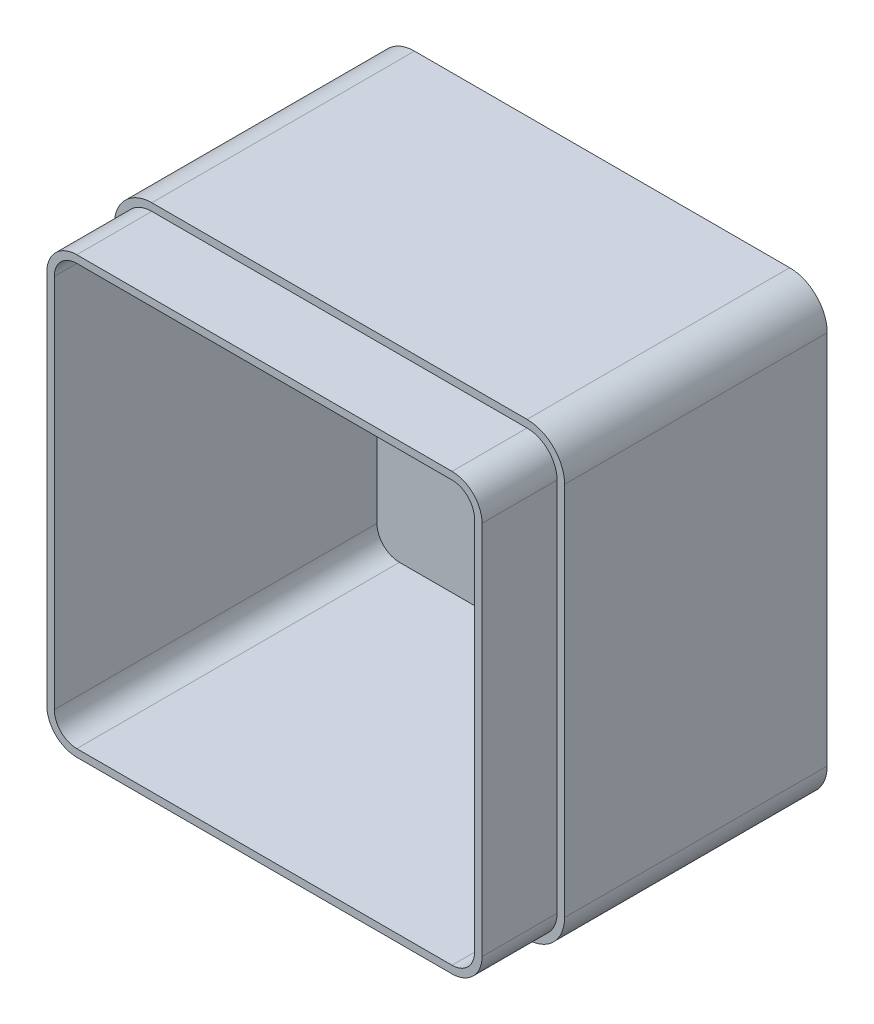
ISO-10303-21;
HEADER;
FILE_DESCRIPTION(('STEP AP214'),'2;1');
FILE_NAME('part.step','',(''),(''),'','','');
FILE_SCHEMA(('AUTOMOTIVE_DESIGN { 1 0 10303 214 1 1 1 1 }'));
ENDSEC;
DATA;
#1=APPLICATION_CONTEXT('core data for automotive mechanical design processes');
#2=APPLICATION_PROTOCOL_DEFINITION('international standard','automotive_design',2000,#1);
#3=PRODUCT_CONTEXT('',#1,'mechanical');
#4=PRODUCT('Part','Part','',(#3));
#5=PRODUCT_RELATED_PRODUCT_CATEGORY('part','',(#4));
#6=PRODUCT_DEFINITION_FORMATION('','',#4);
#7=PRODUCT_DEFINITION_CONTEXT('part definition',#1,'design');
#8=PRODUCT_DEFINITION('design','',#6,#7);
#9=PRODUCT_DEFINITION_SHAPE('','',#8);
#10=(LENGTH_UNIT() NAMED_UNIT(*) SI_UNIT(.MILLI.,.METRE.));
#11=(NAMED_UNIT(*) PLANE_ANGLE_UNIT() SI_UNIT($,.RADIAN.));
#12=(NAMED_UNIT(*) SI_UNIT($,.STERADIAN.) SOLID_ANGLE_UNIT());
#13=UNCERTAINTY_MEASURE_WITH_UNIT(LENGTH_MEASURE(1.E-05),#10,'distance_accuracy_value','');
#14=(GEOMETRIC_REPRESENTATION_CONTEXT(3) GLOBAL_UNCERTAINTY_ASSIGNED_CONTEXT((#13)) GLOBAL_UNIT_ASSIGNED_CONTEXT((#10,
#11,#12)) REPRESENTATION_CONTEXT('',''));
#15=CARTESIAN_POINT('',(0.,0.,0.));
#16=DIRECTION('',(0.,0.,1.));
#17=DIRECTION('',(1.,0.,0.));
#18=AXIS2_PLACEMENT_3D('',#15,#16,#17);
#19=CARTESIAN_POINT('',(0.,0.,90.));
#20=DIRECTION('',(0.,0.,-1.));
#21=DIRECTION('',(-1.,0.,0.));
#22=AXIS2_PLACEMENT_3D('',#19,#20,#21);
#23=PLANE('',#22);
#24=DIRECTION('',(1.,0.,0.));
#25=VECTOR('',#24,1.);
#26=CARTESIAN_POINT('',(0.,4.,90.));
#27=LINE('',#26,#25);
#28=CARTESIAN_POINT('',(9.99999999999999,4.,90.));
#29=VERTEX_POINT('',#28);
#30=CARTESIAN_POINT('',(110.,4.,90.));
#31=VERTEX_POINT('',#30);
#32=EDGE_CURVE('E329',#29,#31,#27,.T.);
#33=ORIENTED_EDGE('',*,*,#32,.F.);
#34=CARTESIAN_POINT('',(10.,10.,90.));
#35=DIRECTION('',(0.,0.,-1.));
#36=DIRECTION('',(-1.,0.,0.));
#37=AXIS2_PLACEMENT_3D('',#34,#35,#36);
#38=CIRCLE('',#37,6.);
#39=CARTESIAN_POINT('',(4.,9.99999999999999,90.));
#40=VERTEX_POINT('',#39);
#41=EDGE_CURVE('E330',#40,#29,#38,.F.);
#42=ORIENTED_EDGE('',*,*,#41,.F.);
#43=DIRECTION('',(0.,-1.,0.));
#44=VECTOR('',#43,1.);
#45=CARTESIAN_POINT('',(4.,0.,90.));
#46=LINE('',#45,#44);
#47=CARTESIAN_POINT('',(4.,110.,90.));
#48=VERTEX_POINT('',#47);
#49=EDGE_CURVE('E310',#48,#40,#46,.T.);
#50=ORIENTED_EDGE('',*,*,#49,.F.);
#51=CARTESIAN_POINT('',(10.,110.,90.));
#52=DIRECTION('',(0.,0.,-1.));
#53=DIRECTION('',(-1.,0.,0.));
#54=AXIS2_PLACEMENT_3D('',#51,#52,#53);
#55=CIRCLE('',#54,6.);
#56=CARTESIAN_POINT('',(9.99999999999999,116.,90.));
#57=VERTEX_POINT('',#56);
#58=EDGE_CURVE('E332',#57,#48,#55,.F.);
#59=ORIENTED_EDGE('',*,*,#58,.F.);
#60=DIRECTION('',(-1.,0.,0.));
#61=VECTOR('',#60,1.);
#62=CARTESIAN_POINT('',(0.,116.,90.));
#63=LINE('',#62,#61);
#64=CARTESIAN_POINT('',(110.,116.,90.));
#65=VERTEX_POINT('',#64);
#66=EDGE_CURVE('E322',#65,#57,#63,.T.);
#67=ORIENTED_EDGE('',*,*,#66,.F.);
#68=CARTESIAN_POINT('',(110.,110.,90.));
#69=DIRECTION('',(0.,0.,-1.));
#70=DIRECTION('',(-1.,0.,0.));
#71=AXIS2_PLACEMENT_3D('',#68,#69,#70);
#72=CIRCLE('',#71,6.);
#73=CARTESIAN_POINT('',(116.,110.,90.));
#74=VERTEX_POINT('',#73);
#75=EDGE_CURVE('E315',#74,#65,#72,.F.);
#76=ORIENTED_EDGE('',*,*,#75,.F.);
#77=DIRECTION('',(0.,1.,0.));
#78=VECTOR('',#77,1.);
#79=CARTESIAN_POINT('',(116.,0.,90.));
#80=LINE('',#79,#78);
#81=CARTESIAN_POINT('',(116.,9.99999999999999,90.));
#82=VERTEX_POINT('',#81);
#83=EDGE_CURVE('E335',#82,#74,#80,.T.);
#84=ORIENTED_EDGE('',*,*,#83,.F.);
#85=CARTESIAN_POINT('',(110.,10.,90.));
#86=DIRECTION('',(0.,0.,-1.));
#87=DIRECTION('',(-1.,0.,0.));
#88=AXIS2_PLACEMENT_3D('',#85,#86,#87);
#89=CIRCLE('',#88,6.);
#90=EDGE_CURVE('E293',#31,#82,#89,.F.);
#91=ORIENTED_EDGE('',*,*,#90,.F.);
#92=EDGE_LOOP('',(#33,#42,#50,#59,#67,#76,#84,#91));
#93=FACE_BOUND('',#92,.T.);
#94=CARTESIAN_POINT('',(10.,110.,90.));
#95=DIRECTION('',(0.,0.,1.));
#96=DIRECTION('',(1.,0.,0.));
#97=AXIS2_PLACEMENT_3D('',#94,#95,#96);
#98=CIRCLE('',#97,8.);
#99=CARTESIAN_POINT('',(9.99999999999999,118.,90.));
#100=VERTEX_POINT('',#99);
#101=CARTESIAN_POINT('',(2.,110.,90.));
#102=VERTEX_POINT('',#101);
#103=EDGE_CURVE('E240',#100,#102,#98,.T.);
#104=ORIENTED_EDGE('',*,*,#103,.T.);
#105=DIRECTION('',(0.,-1.,0.));
#106=VECTOR('',#105,1.);
#107=CARTESIAN_POINT('',(2.,110.,90.));
#108=LINE('',#107,#106);
#109=CARTESIAN_POINT('',(2.,9.99999999999999,90.));
#110=VERTEX_POINT('',#109);
#111=EDGE_CURVE('E200',#102,#110,#108,.T.);
#112=ORIENTED_EDGE('',*,*,#111,.T.);
#113=CARTESIAN_POINT('',(10.,10.,90.));
#114=DIRECTION('',(0.,0.,1.));
#115=DIRECTION('',(1.,0.,0.));
#116=AXIS2_PLACEMENT_3D('',#113,#114,#115);
#117=CIRCLE('',#116,8.);
#118=CARTESIAN_POINT('',(9.99999999999999,2.,90.));
#119=VERTEX_POINT('',#118);
#120=EDGE_CURVE('E48',#110,#119,#117,.T.);
#121=ORIENTED_EDGE('',*,*,#120,.T.);
#122=DIRECTION('',(1.,0.,0.));
#123=VECTOR('',#122,1.);
#124=CARTESIAN_POINT('',(9.99999999999999,2.,90.));
#125=LINE('',#124,#123);
#126=CARTESIAN_POINT('',(110.,2.,90.));
#127=VERTEX_POINT('',#126);
#128=EDGE_CURVE('E244',#119,#127,#125,.T.);
#129=ORIENTED_EDGE('',*,*,#128,.T.);
#130=CARTESIAN_POINT('',(110.,10.,90.));
#131=DIRECTION('',(0.,0.,1.));
#132=DIRECTION('',(1.,0.,0.));
#133=AXIS2_PLACEMENT_3D('',#130,#131,#132);
#134=CIRCLE('',#133,7.99999999999999);
#135=CARTESIAN_POINT('',(118.,10.,90.));
#136=VERTEX_POINT('',#135);
#137=EDGE_CURVE('E247',#127,#136,#134,.T.);
#138=ORIENTED_EDGE('',*,*,#137,.T.);
#139=DIRECTION('',(0.,1.,0.));
#140=VECTOR('',#139,1.);
#141=CARTESIAN_POINT('',(118.,9.99999999999999,90.));
#142=LINE('',#141,#140);
#143=CARTESIAN_POINT('',(118.,110.,90.));
#144=VERTEX_POINT('',#143);
#145=EDGE_CURVE('E250',#136,#144,#142,.T.);
#146=ORIENTED_EDGE('',*,*,#145,.T.);
#147=CARTESIAN_POINT('',(110.,110.,90.));
#148=DIRECTION('',(0.,0.,1.));
#149=DIRECTION('',(1.,0.,0.));
#150=AXIS2_PLACEMENT_3D('',#147,#148,#149);
#151=CIRCLE('',#150,7.99999999999999);
#152=CARTESIAN_POINT('',(110.,118.,90.));
#153=VERTEX_POINT('',#152);
#154=EDGE_CURVE('E223',#144,#153,#151,.T.);
#155=ORIENTED_EDGE('',*,*,#154,.T.);
#156=DIRECTION('',(-1.,0.,0.));
#157=VECTOR('',#156,1.);
#158=CARTESIAN_POINT('',(110.,118.,90.));
#159=LINE('',#158,#157);
#160=EDGE_CURVE('E220',#153,#100,#159,.T.);
#161=ORIENTED_EDGE('',*,*,#160,.T.);
#162=EDGE_LOOP('',(#104,#112,#121,#129,#138,#146,#155,#161));
#163=FACE_BOUND('',#162,.T.);
#164=ADVANCED_FACE('F33',(#93,#163),#23,.F.);
#165=CARTESIAN_POINT('',(4.,0.,90.));
#166=DIRECTION('',(1.,0.,0.));
#167=DIRECTION('',(0.,0.,-1.));
#168=AXIS2_PLACEMENT_3D('',#165,#166,#167);
#169=PLANE('',#168);
#170=DIRECTION('',(0.,-1.,0.));
#171=VECTOR('',#170,1.);
#172=CARTESIAN_POINT('',(4.,0.,4.));
#173=LINE('',#172,#171);
#174=CARTESIAN_POINT('',(4.,110.,4.));
#175=VERTEX_POINT('',#174);
#176=CARTESIAN_POINT('',(4.,9.99999999999999,4.));
#177=VERTEX_POINT('',#176);
#178=EDGE_CURVE('E282',#175,#177,#173,.T.);
#179=ORIENTED_EDGE('',*,*,#178,.F.);
#180=DIRECTION('',(0.,0.,-1.));
#181=VECTOR('',#180,1.);
#182=CARTESIAN_POINT('',(4.,110.,90.));
#183=LINE('',#182,#181);
#184=EDGE_CURVE('E290',#48,#175,#183,.T.);
#185=ORIENTED_EDGE('',*,*,#184,.F.);
#186=ORIENTED_EDGE('',*,*,#49,.T.);
#187=DIRECTION('',(0.,0.,-1.));
#188=VECTOR('',#187,1.);
#189=CARTESIAN_POINT('',(4.,9.99999999999999,90.));
#190=LINE('',#189,#188);
#191=EDGE_CURVE('E286',#177,#40,#190,.F.);
#192=ORIENTED_EDGE('',*,*,#191,.F.);
#193=EDGE_LOOP('',(#179,#185,#186,#192));
#194=FACE_BOUND('',#193,.T.);
#195=ADVANCED_FACE('F426',(#194),#169,.T.);
#196=CARTESIAN_POINT('',(0.,4.,90.));
#197=DIRECTION('',(0.,1.,0.));
#198=DIRECTION('',(0.,0.,1.));
#199=AXIS2_PLACEMENT_3D('',#196,#197,#198);
#200=PLANE('',#199);
#201=DIRECTION('',(1.,0.,0.));
#202=VECTOR('',#201,1.);
#203=CARTESIAN_POINT('',(0.,4.,4.));
#204=LINE('',#203,#202);
#205=CARTESIAN_POINT('',(9.99999999999999,4.,4.));
#206=VERTEX_POINT('',#205);
#207=CARTESIAN_POINT('',(110.,4.,4.));
#208=VERTEX_POINT('',#207);
#209=EDGE_CURVE('E285',#206,#208,#204,.T.);
#210=ORIENTED_EDGE('',*,*,#209,.F.);
#211=DIRECTION('',(0.,0.,1.));
#212=VECTOR('',#211,1.);
#213=CARTESIAN_POINT('',(9.99999999999999,4.,90.));
#214=LINE('',#213,#212);
#215=EDGE_CURVE('E300',#29,#206,#214,.F.);
#216=ORIENTED_EDGE('',*,*,#215,.F.);
#217=ORIENTED_EDGE('',*,*,#32,.T.);
#218=DIRECTION('',(0.,0.,1.));
#219=VECTOR('',#218,1.);
#220=CARTESIAN_POINT('',(110.,4.,90.));
#221=LINE('',#220,#219);
#222=EDGE_CURVE('E313',#208,#31,#221,.T.);
#223=ORIENTED_EDGE('',*,*,#222,.F.);
#224=EDGE_LOOP('',(#210,#216,#217,#223));
#225=FACE_BOUND('',#224,.T.);
#226=ADVANCED_FACE('F432',(#225),#200,.T.);
#227=CARTESIAN_POINT('',(116.,0.,90.));
#228=DIRECTION('',(-1.,0.,0.));
#229=DIRECTION('',(0.,0.,1.));
#230=AXIS2_PLACEMENT_3D('',#227,#228,#229);
#231=PLANE('',#230);
#232=ORIENTED_EDGE('',*,*,#83,.T.);
#233=DIRECTION('',(0.,0.,1.));
#234=VECTOR('',#233,1.);
#235=CARTESIAN_POINT('',(116.,110.,90.));
#236=LINE('',#235,#234);
#237=CARTESIAN_POINT('',(116.,110.,4.));
#238=VERTEX_POINT('',#237);
#239=EDGE_CURVE('E320',#238,#74,#236,.T.);
#240=ORIENTED_EDGE('',*,*,#239,.F.);
#241=DIRECTION('',(0.,1.,0.));
#242=VECTOR('',#241,1.);
#243=CARTESIAN_POINT('',(116.,0.,4.));
#244=LINE('',#243,#242);
#245=CARTESIAN_POINT('',(116.,9.99999999999999,4.));
#246=VERTEX_POINT('',#245);
#247=EDGE_CURVE('E294',#246,#238,#244,.T.);
#248=ORIENTED_EDGE('',*,*,#247,.F.);
#249=DIRECTION('',(0.,0.,1.));
#250=VECTOR('',#249,1.);
#251=CARTESIAN_POINT('',(116.,9.99999999999999,90.));
#252=LINE('',#251,#250);
#253=EDGE_CURVE('E312',#82,#246,#252,.F.);
#254=ORIENTED_EDGE('',*,*,#253,.F.);
#255=EDGE_LOOP('',(#232,#240,#248,#254));
#256=FACE_BOUND('',#255,.T.);
#257=ADVANCED_FACE('F622',(#256),#231,.T.);
#258=CARTESIAN_POINT('',(0.,116.,90.));
#259=DIRECTION('',(0.,-1.,0.));
#260=DIRECTION('',(0.,0.,-1.));
#261=AXIS2_PLACEMENT_3D('',#258,#259,#260);
#262=PLANE('',#261);
#263=DIRECTION('',(-1.,0.,0.));
#264=VECTOR('',#263,1.);
#265=CARTESIAN_POINT('',(0.,116.,4.));
#266=LINE('',#265,#264);
#267=CARTESIAN_POINT('',(110.,116.,4.));
#268=VERTEX_POINT('',#267);
#269=CARTESIAN_POINT('',(9.99999999999999,116.,4.));
#270=VERTEX_POINT('',#269);
#271=EDGE_CURVE('E297',#268,#270,#266,.T.);
#272=ORIENTED_EDGE('',*,*,#271,.F.);
#273=DIRECTION('',(0.,0.,-1.));
#274=VECTOR('',#273,1.);
#275=CARTESIAN_POINT('',(110.,116.,90.));
#276=LINE('',#275,#274);
#277=EDGE_CURVE('E289',#65,#268,#276,.T.);
#278=ORIENTED_EDGE('',*,*,#277,.F.);
#279=ORIENTED_EDGE('',*,*,#66,.T.);
#280=DIRECTION('',(0.,0.,-1.));
#281=VECTOR('',#280,1.);
#282=CARTESIAN_POINT('',(9.99999999999999,116.,90.));
#283=LINE('',#282,#281);
#284=EDGE_CURVE('E325',#270,#57,#283,.F.);
#285=ORIENTED_EDGE('',*,*,#284,.F.);
#286=EDGE_LOOP('',(#272,#278,#279,#285));
#287=FACE_BOUND('',#286,.T.);
#288=ADVANCED_FACE('F613',(#287),#262,.T.);
#289=CARTESIAN_POINT('',(0.,0.,4.));
#290=DIRECTION('',(0.,0.,-1.));
#291=DIRECTION('',(-1.,0.,0.));
#292=AXIS2_PLACEMENT_3D('',#289,#290,#291);
#293=PLANE('',#292);
#294=ORIENTED_EDGE('',*,*,#247,.T.);
#295=CARTESIAN_POINT('',(110.,110.,4.));
#296=DIRECTION('',(0.,0.,-1.));
#297=DIRECTION('',(-1.,0.,0.));
#298=AXIS2_PLACEMENT_3D('',#295,#296,#297);
#299=CIRCLE('',#298,6.);
#300=EDGE_CURVE('E307',#268,#238,#299,.T.);
#301=ORIENTED_EDGE('',*,*,#300,.F.);
#302=ORIENTED_EDGE('',*,*,#271,.T.);
#303=CARTESIAN_POINT('',(10.,110.,4.));
#304=DIRECTION('',(0.,0.,-1.));
#305=DIRECTION('',(-1.,0.,0.));
#306=AXIS2_PLACEMENT_3D('',#303,#304,#305);
#307=CIRCLE('',#306,6.);
#308=EDGE_CURVE('E305',#175,#270,#307,.T.);
#309=ORIENTED_EDGE('',*,*,#308,.F.);
#310=ORIENTED_EDGE('',*,*,#178,.T.);
#311=CARTESIAN_POINT('',(10.,10.,4.));
#312=DIRECTION('',(0.,0.,-1.));
#313=DIRECTION('',(-1.,0.,0.));
#314=AXIS2_PLACEMENT_3D('',#311,#312,#313);
#315=CIRCLE('',#314,6.);
#316=EDGE_CURVE('E301',#206,#177,#315,.T.);
#317=ORIENTED_EDGE('',*,*,#316,.F.);
#318=ORIENTED_EDGE('',*,*,#209,.T.);
#319=CARTESIAN_POINT('',(110.,10.,4.));
#320=DIRECTION('',(0.,0.,-1.));
#321=DIRECTION('',(-1.,0.,0.));
#322=AXIS2_PLACEMENT_3D('',#319,#320,#321);
#323=CIRCLE('',#322,6.);
#324=EDGE_CURVE('E298',#246,#208,#323,.T.);
#325=ORIENTED_EDGE('',*,*,#324,.F.);
#326=EDGE_LOOP('',(#294,#301,#302,#309,#310,#317,#318,#325));
#327=FACE_BOUND('',#326,.T.);
#328=ADVANCED_FACE('F604',(#327),#293,.F.);
#329=CARTESIAN_POINT('',(110.,10.,90.));
#330=DIRECTION('',(0.,0.,-1.));
#331=DIRECTION('',(-1.,0.,0.));
#332=AXIS2_PLACEMENT_3D('',#329,#330,#331);
#333=CYLINDRICAL_SURFACE('',#332,6.);
#334=ORIENTED_EDGE('',*,*,#90,.T.);
#335=ORIENTED_EDGE('',*,*,#253,.T.);
#336=ORIENTED_EDGE('',*,*,#324,.T.);
#337=ORIENTED_EDGE('',*,*,#222,.T.);
#338=EDGE_LOOP('',(#334,#335,#336,#337));
#339=FACE_BOUND('',#338,.T.);
#340=ADVANCED_FACE('F595',(#339),#333,.F.);
#341=CARTESIAN_POINT('',(10.,10.,90.));
#342=DIRECTION('',(0.,0.,-1.));
#343=DIRECTION('',(-1.,0.,0.));
#344=AXIS2_PLACEMENT_3D('',#341,#342,#343);
#345=CYLINDRICAL_SURFACE('',#344,6.);
#346=ORIENTED_EDGE('',*,*,#41,.T.);
#347=ORIENTED_EDGE('',*,*,#215,.T.);
#348=ORIENTED_EDGE('',*,*,#316,.T.);
#349=ORIENTED_EDGE('',*,*,#191,.T.);
#350=EDGE_LOOP('',(#346,#347,#348,#349));
#351=FACE_BOUND('',#350,.T.);
#352=ADVANCED_FACE('F587',(#351),#345,.F.);
#353=CARTESIAN_POINT('',(10.,110.,90.));
#354=DIRECTION('',(0.,0.,-1.));
#355=DIRECTION('',(-1.,0.,0.));
#356=AXIS2_PLACEMENT_3D('',#353,#354,#355);
#357=CYLINDRICAL_SURFACE('',#356,6.);
#358=ORIENTED_EDGE('',*,*,#58,.T.);
#359=ORIENTED_EDGE('',*,*,#184,.T.);
#360=ORIENTED_EDGE('',*,*,#308,.T.);
#361=ORIENTED_EDGE('',*,*,#284,.T.);
#362=EDGE_LOOP('',(#358,#359,#360,#361));
#363=FACE_BOUND('',#362,.T.);
#364=ADVANCED_FACE('F579',(#363),#357,.F.);
#365=CARTESIAN_POINT('',(110.,110.,90.));
#366=DIRECTION('',(0.,0.,-1.));
#367=DIRECTION('',(-1.,0.,0.));
#368=AXIS2_PLACEMENT_3D('',#365,#366,#367);
#369=CYLINDRICAL_SURFACE('',#368,6.);
#370=ORIENTED_EDGE('',*,*,#75,.T.);
#371=ORIENTED_EDGE('',*,*,#277,.T.);
#372=ORIENTED_EDGE('',*,*,#300,.T.);
#373=ORIENTED_EDGE('',*,*,#239,.T.);
#374=EDGE_LOOP('',(#370,#371,#372,#373));
#375=FACE_BOUND('',#374,.T.);
#376=ADVANCED_FACE('F439',(#375),#369,.F.);
#377=CARTESIAN_POINT('',(10.,10.,70.));
#378=DIRECTION('',(0.,0.,1.));
#379=DIRECTION('',(1.,0.,0.));
#380=AXIS2_PLACEMENT_3D('',#377,#378,#379);
#381=PLANE('',#380);
#382=DIRECTION('',(-1.,0.,0.));
#383=VECTOR('',#382,1.);
#384=CARTESIAN_POINT('',(110.,118.,70.));
#385=LINE('',#384,#383);
#386=CARTESIAN_POINT('',(110.,118.,70.));
#387=VERTEX_POINT('',#386);
#388=CARTESIAN_POINT('',(9.99999999999999,118.,70.));
#389=VERTEX_POINT('',#388);
#390=EDGE_CURVE('E206',#387,#389,#385,.T.);
#391=ORIENTED_EDGE('',*,*,#390,.F.);
#392=CARTESIAN_POINT('',(110.,110.,70.));
#393=DIRECTION('',(0.,0.,1.));
#394=DIRECTION('',(1.,0.,0.));
#395=AXIS2_PLACEMENT_3D('',#392,#393,#394);
#396=CIRCLE('',#395,7.99999999999999);
#397=CARTESIAN_POINT('',(118.,110.,70.));
#398=VERTEX_POINT('',#397);
#399=EDGE_CURVE('E236',#398,#387,#396,.T.);
#400=ORIENTED_EDGE('',*,*,#399,.F.);
#401=DIRECTION('',(0.,1.,0.));
#402=VECTOR('',#401,1.);
#403=CARTESIAN_POINT('',(118.,9.99999999999999,70.));
#404=LINE('',#403,#402);
#405=CARTESIAN_POINT('',(118.,10.,70.));
#406=VERTEX_POINT('',#405);
#407=EDGE_CURVE('E233',#406,#398,#404,.T.);
#408=ORIENTED_EDGE('',*,*,#407,.F.);
#409=CARTESIAN_POINT('',(110.,10.,70.));
#410=DIRECTION('',(0.,0.,1.));
#411=DIRECTION('',(1.,0.,0.));
#412=AXIS2_PLACEMENT_3D('',#409,#410,#411);
#413=CIRCLE('',#412,7.99999999999999);
#414=CARTESIAN_POINT('',(110.,2.,70.));
#415=VERTEX_POINT('',#414);
#416=EDGE_CURVE('E230',#415,#406,#413,.T.);
#417=ORIENTED_EDGE('',*,*,#416,.F.);
#418=DIRECTION('',(1.,0.,0.));
#419=VECTOR('',#418,1.);
#420=CARTESIAN_POINT('',(9.99999999999999,2.,70.));
#421=LINE('',#420,#419);
#422=CARTESIAN_POINT('',(9.99999999999999,2.,70.));
#423=VERTEX_POINT('',#422);
#424=EDGE_CURVE('E227',#423,#415,#421,.T.);
#425=ORIENTED_EDGE('',*,*,#424,.F.);
#426=CARTESIAN_POINT('',(10.,10.,70.));
#427=DIRECTION('',(0.,0.,1.));
#428=DIRECTION('',(1.,0.,0.));
#429=AXIS2_PLACEMENT_3D('',#426,#427,#428);
#430=CIRCLE('',#429,8.);
#431=CARTESIAN_POINT('',(2.,9.99999999999999,70.));
#432=VERTEX_POINT('',#431);
#433=EDGE_CURVE('E216',#432,#423,#430,.T.);
#434=ORIENTED_EDGE('',*,*,#433,.F.);
#435=DIRECTION('',(0.,-1.,0.));
#436=VECTOR('',#435,1.);
#437=CARTESIAN_POINT('',(2.,110.,70.));
#438=LINE('',#437,#436);
#439=CARTESIAN_POINT('',(2.,110.,70.));
#440=VERTEX_POINT('',#439);
#441=EDGE_CURVE('E198',#440,#432,#438,.T.);
#442=ORIENTED_EDGE('',*,*,#441,.F.);
#443=CARTESIAN_POINT('',(10.,110.,70.));
#444=DIRECTION('',(0.,0.,1.));
#445=DIRECTION('',(1.,0.,0.));
#446=AXIS2_PLACEMENT_3D('',#443,#444,#445);
#447=CIRCLE('',#446,8.);
#448=EDGE_CURVE('E212',#389,#440,#447,.T.);
#449=ORIENTED_EDGE('',*,*,#448,.F.);
#450=EDGE_LOOP('',(#391,#400,#408,#417,#425,#434,#442,#449));
#451=FACE_BOUND('',#450,.T.);
#452=CARTESIAN_POINT('',(10.,10.,70.));
#453=DIRECTION('',(0.,0.,1.));
#454=DIRECTION('',(1.,0.,0.));
#455=AXIS2_PLACEMENT_3D('',#452,#453,#454);
#456=CIRCLE('',#455,10.);
#457=CARTESIAN_POINT('',(0.,10.,70.));
#458=VERTEX_POINT('',#457);
#459=CARTESIAN_POINT('',(9.99999999999999,0.,70.));
#460=VERTEX_POINT('',#459);
#461=EDGE_CURVE('E256',#458,#460,#456,.T.);
#462=ORIENTED_EDGE('',*,*,#461,.T.);
#463=DIRECTION('',(1.,0.,0.));
#464=VECTOR('',#463,1.);
#465=CARTESIAN_POINT('',(9.99999999999999,0.,70.));
#466=LINE('',#465,#464);
#467=CARTESIAN_POINT('',(110.,0.,70.));
#468=VERTEX_POINT('',#467);
#469=EDGE_CURVE('E269',#460,#468,#466,.T.);
#470=ORIENTED_EDGE('',*,*,#469,.T.);
#471=CARTESIAN_POINT('',(110.,10.,70.));
#472=DIRECTION('',(0.,0.,1.));
#473=DIRECTION('',(1.,0.,0.));
#474=AXIS2_PLACEMENT_3D('',#471,#472,#473);
#475=CIRCLE('',#474,9.99999999999999);
#476=CARTESIAN_POINT('',(120.,10.,70.));
#477=VERTEX_POINT('',#476);
#478=EDGE_CURVE('E271',#468,#477,#475,.T.);
#479=ORIENTED_EDGE('',*,*,#478,.T.);
#480=DIRECTION('',(0.,1.,0.));
#481=VECTOR('',#480,1.);
#482=CARTESIAN_POINT('',(120.,10.,70.));
#483=LINE('',#482,#481);
#484=CARTESIAN_POINT('',(120.,110.,70.));
#485=VERTEX_POINT('',#484);
#486=EDGE_CURVE('E56',#477,#485,#483,.T.);
#487=ORIENTED_EDGE('',*,*,#486,.T.);
#488=CARTESIAN_POINT('',(110.,110.,70.));
#489=DIRECTION('',(0.,0.,1.));
#490=DIRECTION('',(1.,0.,0.));
#491=AXIS2_PLACEMENT_3D('',#488,#489,#490);
#492=CIRCLE('',#491,9.99999999999999);
#493=CARTESIAN_POINT('',(110.,120.,70.));
#494=VERTEX_POINT('',#493);
#495=EDGE_CURVE('E274',#485,#494,#492,.T.);
#496=ORIENTED_EDGE('',*,*,#495,.T.);
#497=DIRECTION('',(-1.,0.,0.));
#498=VECTOR('',#497,1.);
#499=CARTESIAN_POINT('',(110.,120.,70.));
#500=LINE('',#499,#498);
#501=CARTESIAN_POINT('',(10.,120.,70.));
#502=VERTEX_POINT('',#501);
#503=EDGE_CURVE('E276',#494,#502,#500,.T.);
#504=ORIENTED_EDGE('',*,*,#503,.T.);
#505=CARTESIAN_POINT('',(10.,110.,70.));
#506=DIRECTION('',(0.,0.,1.));
#507=DIRECTION('',(1.,0.,0.));
#508=AXIS2_PLACEMENT_3D('',#505,#506,#507);
#509=CIRCLE('',#508,9.99999999999999);
#510=CARTESIAN_POINT('',(0.,110.,70.));
#511=VERTEX_POINT('',#510);
#512=EDGE_CURVE('E278',#502,#511,#509,.T.);
#513=ORIENTED_EDGE('',*,*,#512,.T.);
#514=DIRECTION('',(0.,-1.,0.));
#515=VECTOR('',#514,1.);
#516=CARTESIAN_POINT('',(0.,110.,70.));
#517=LINE('',#516,#515);
#518=EDGE_CURVE('E280',#511,#458,#517,.T.);
#519=ORIENTED_EDGE('',*,*,#518,.T.);
#520=EDGE_LOOP('',(#462,#470,#479,#487,#496,#504,#513,#519));
#521=FACE_BOUND('',#520,.T.);
#522=ADVANCED_FACE('F211',(#451,#521),#381,.T.);
#523=CARTESIAN_POINT('',(10.,110.,70.));
#524=DIRECTION('',(0.,0.,1.));
#525=DIRECTION('',(1.,0.,0.));
#526=AXIS2_PLACEMENT_3D('',#523,#524,#525);
#527=CYLINDRICAL_SURFACE('',#526,8.);
#528=ORIENTED_EDGE('',*,*,#103,.F.);
#529=DIRECTION('',(0.,0.,1.));
#530=VECTOR('',#529,1.);
#531=CARTESIAN_POINT('',(9.99999999999999,118.,70.));
#532=LINE('',#531,#530);
#533=EDGE_CURVE('E219',#389,#100,#532,.T.);
#534=ORIENTED_EDGE('',*,*,#533,.F.);
#535=ORIENTED_EDGE('',*,*,#448,.T.);
#536=DIRECTION('',(0.,0.,1.));
#537=VECTOR('',#536,1.);
#538=CARTESIAN_POINT('',(2.,110.,70.));
#539=LINE('',#538,#537);
#540=EDGE_CURVE('E195',#440,#102,#539,.T.);
#541=ORIENTED_EDGE('',*,*,#540,.T.);
#542=EDGE_LOOP('',(#528,#534,#535,#541));
#543=FACE_BOUND('',#542,.T.);
#544=ADVANCED_FACE('F218',(#543),#527,.T.);
#545=CARTESIAN_POINT('',(110.,118.,70.));
#546=DIRECTION('',(0.,1.,0.));
#547=DIRECTION('',(0.,0.,1.));
#548=AXIS2_PLACEMENT_3D('',#545,#546,#547);
#549=PLANE('',#548);
#550=ORIENTED_EDGE('',*,*,#160,.F.);
#551=DIRECTION('',(0.,0.,1.));
#552=VECTOR('',#551,1.);
#553=CARTESIAN_POINT('',(110.,118.,70.));
#554=LINE('',#553,#552);
#555=EDGE_CURVE('E257',#387,#153,#554,.T.);
#556=ORIENTED_EDGE('',*,*,#555,.F.);
#557=ORIENTED_EDGE('',*,*,#390,.T.);
#558=ORIENTED_EDGE('',*,*,#533,.T.);
#559=EDGE_LOOP('',(#550,#556,#557,#558));
#560=FACE_BOUND('',#559,.T.);
#561=ADVANCED_FACE('F487',(#560),#549,.T.);
#562=CARTESIAN_POINT('',(110.,110.,70.));
#563=DIRECTION('',(0.,0.,1.));
#564=DIRECTION('',(1.,0.,0.));
#565=AXIS2_PLACEMENT_3D('',#562,#563,#564);
#566=CYLINDRICAL_SURFACE('',#565,7.99999999999999);
#567=ORIENTED_EDGE('',*,*,#154,.F.);
#568=DIRECTION('',(0.,0.,1.));
#569=VECTOR('',#568,1.);
#570=CARTESIAN_POINT('',(118.,110.,70.));
#571=LINE('',#570,#569);
#572=EDGE_CURVE('E259',#398,#144,#571,.T.);
#573=ORIENTED_EDGE('',*,*,#572,.F.);
#574=ORIENTED_EDGE('',*,*,#399,.T.);
#575=ORIENTED_EDGE('',*,*,#555,.T.);
#576=EDGE_LOOP('',(#567,#573,#574,#575));
#577=FACE_BOUND('',#576,.T.);
#578=ADVANCED_FACE('F495',(#577),#566,.T.);
#579=CARTESIAN_POINT('',(118.,9.99999999999999,70.));
#580=DIRECTION('',(1.,0.,0.));
#581=DIRECTION('',(0.,0.,-1.));
#582=AXIS2_PLACEMENT_3D('',#579,#580,#581);
#583=PLANE('',#582);
#584=ORIENTED_EDGE('',*,*,#145,.F.);
#585=DIRECTION('',(0.,0.,1.));
#586=VECTOR('',#585,1.);
#587=CARTESIAN_POINT('',(118.,10.,70.));
#588=LINE('',#587,#586);
#589=EDGE_CURVE('E261',#406,#136,#588,.T.);
#590=ORIENTED_EDGE('',*,*,#589,.F.);
#591=ORIENTED_EDGE('',*,*,#407,.T.);
#592=ORIENTED_EDGE('',*,*,#572,.T.);
#593=EDGE_LOOP('',(#584,#590,#591,#592));
#594=FACE_BOUND('',#593,.T.);
#595=ADVANCED_FACE('F504',(#594),#583,.T.);
#596=CARTESIAN_POINT('',(110.,10.,70.));
#597=DIRECTION('',(0.,0.,1.));
#598=DIRECTION('',(1.,0.,0.));
#599=AXIS2_PLACEMENT_3D('',#596,#597,#598);
#600=CYLINDRICAL_SURFACE('',#599,7.99999999999999);
#601=ORIENTED_EDGE('',*,*,#137,.F.);
#602=DIRECTION('',(0.,0.,1.));
#603=VECTOR('',#602,1.);
#604=CARTESIAN_POINT('',(110.,2.,70.));
#605=LINE('',#604,#603);
#606=EDGE_CURVE('E263',#415,#127,#605,.T.);
#607=ORIENTED_EDGE('',*,*,#606,.F.);
#608=ORIENTED_EDGE('',*,*,#416,.T.);
#609=ORIENTED_EDGE('',*,*,#589,.T.);
#610=EDGE_LOOP('',(#601,#607,#608,#609));
#611=FACE_BOUND('',#610,.T.);
#612=ADVANCED_FACE('F513',(#611),#600,.T.);
#613=CARTESIAN_POINT('',(9.99999999999999,2.,70.));
#614=DIRECTION('',(0.,-1.,0.));
#615=DIRECTION('',(0.,0.,-1.));
#616=AXIS2_PLACEMENT_3D('',#613,#614,#615);
#617=PLANE('',#616);
#618=ORIENTED_EDGE('',*,*,#128,.F.);
#619=DIRECTION('',(0.,0.,1.));
#620=VECTOR('',#619,1.);
#621=CARTESIAN_POINT('',(9.99999999999999,2.,70.));
#622=LINE('',#621,#620);
#623=EDGE_CURVE('E265',#423,#119,#622,.T.);
#624=ORIENTED_EDGE('',*,*,#623,.F.);
#625=ORIENTED_EDGE('',*,*,#424,.T.);
#626=ORIENTED_EDGE('',*,*,#606,.T.);
#627=EDGE_LOOP('',(#618,#624,#625,#626));
#628=FACE_BOUND('',#627,.T.);
#629=ADVANCED_FACE('F522',(#628),#617,.T.);
#630=CARTESIAN_POINT('',(10.,10.,70.));
#631=DIRECTION('',(0.,0.,1.));
#632=DIRECTION('',(1.,0.,0.));
#633=AXIS2_PLACEMENT_3D('',#630,#631,#632);
#634=CYLINDRICAL_SURFACE('',#633,8.);
#635=ORIENTED_EDGE('',*,*,#120,.F.);
#636=DIRECTION('',(0.,0.,1.));
#637=VECTOR('',#636,1.);
#638=CARTESIAN_POINT('',(2.,9.99999999999999,70.));
#639=LINE('',#638,#637);
#640=EDGE_CURVE('E205',#432,#110,#639,.T.);
#641=ORIENTED_EDGE('',*,*,#640,.F.);
#642=ORIENTED_EDGE('',*,*,#433,.T.);
#643=ORIENTED_EDGE('',*,*,#623,.T.);
#644=EDGE_LOOP('',(#635,#641,#642,#643));
#645=FACE_BOUND('',#644,.T.);
#646=ADVANCED_FACE('F531',(#645),#634,.T.);
#647=CARTESIAN_POINT('',(2.,110.,70.));
#648=DIRECTION('',(-1.,0.,0.));
#649=DIRECTION('',(0.,0.,1.));
#650=AXIS2_PLACEMENT_3D('',#647,#648,#649);
#651=PLANE('',#650);
#652=ORIENTED_EDGE('',*,*,#111,.F.);
#653=ORIENTED_EDGE('',*,*,#540,.F.);
#654=ORIENTED_EDGE('',*,*,#441,.T.);
#655=ORIENTED_EDGE('',*,*,#640,.T.);
#656=EDGE_LOOP('',(#652,#653,#654,#655));
#657=FACE_BOUND('',#656,.T.);
#658=ADVANCED_FACE('F197',(#657),#651,.T.);
#659=CARTESIAN_POINT('',(0.,0.,0.));
#660=DIRECTION('',(0.,0.,-1.));
#661=DIRECTION('',(-1.,0.,0.));
#662=AXIS2_PLACEMENT_3D('',#659,#660,#661);
#663=PLANE('',#662);
#664=DIRECTION('',(0.,1.,0.));
#665=VECTOR('',#664,1.);
#666=CARTESIAN_POINT('',(120.,0.,0.));
#667=LINE('',#666,#665);
#668=CARTESIAN_POINT('',(120.,10.,0.));
#669=VERTEX_POINT('',#668);
#670=CARTESIAN_POINT('',(120.,110.,0.));
#671=VERTEX_POINT('',#670);
#672=EDGE_CURVE('E348',#669,#671,#667,.T.);
#673=ORIENTED_EDGE('',*,*,#672,.F.);
#674=CARTESIAN_POINT('',(110.,10.,0.));
#675=DIRECTION('',(0.,0.,-1.));
#676=DIRECTION('',(-1.,0.,0.));
#677=AXIS2_PLACEMENT_3D('',#674,#675,#676);
#678=CIRCLE('',#677,10.);
#679=CARTESIAN_POINT('',(110.,0.,0.));
#680=VERTEX_POINT('',#679);
#681=EDGE_CURVE('E365',#669,#680,#678,.T.);
#682=ORIENTED_EDGE('',*,*,#681,.T.);
#683=DIRECTION('',(1.,0.,0.));
#684=VECTOR('',#683,1.);
#685=CARTESIAN_POINT('',(0.,0.,0.));
#686=LINE('',#685,#684);
#687=CARTESIAN_POINT('',(10.,0.,0.));
#688=VERTEX_POINT('',#687);
#689=EDGE_CURVE('E345',#688,#680,#686,.T.);
#690=ORIENTED_EDGE('',*,*,#689,.F.);
#691=CARTESIAN_POINT('',(10.,10.,0.));
#692=DIRECTION('',(0.,0.,-1.));
#693=DIRECTION('',(-1.,0.,0.));
#694=AXIS2_PLACEMENT_3D('',#691,#692,#693);
#695=CIRCLE('',#694,10.);
#696=CARTESIAN_POINT('',(0.,10.,0.));
#697=VERTEX_POINT('',#696);
#698=EDGE_CURVE('E363',#688,#697,#695,.T.);
#699=ORIENTED_EDGE('',*,*,#698,.T.);
#700=DIRECTION('',(0.,-1.,0.));
#701=VECTOR('',#700,1.);
#702=CARTESIAN_POINT('',(0.,0.,0.));
#703=LINE('',#702,#701);
#704=CARTESIAN_POINT('',(0.,110.,0.));
#705=VERTEX_POINT('',#704);
#706=EDGE_CURVE('E327',#705,#697,#703,.T.);
#707=ORIENTED_EDGE('',*,*,#706,.F.);
#708=CARTESIAN_POINT('',(10.,110.,0.));
#709=DIRECTION('',(0.,0.,-1.));
#710=DIRECTION('',(-1.,0.,0.));
#711=AXIS2_PLACEMENT_3D('',#708,#709,#710);
#712=CIRCLE('',#711,10.);
#713=CARTESIAN_POINT('',(10.,120.,0.));
#714=VERTEX_POINT('',#713);
#715=EDGE_CURVE('E361',#705,#714,#712,.T.);
#716=ORIENTED_EDGE('',*,*,#715,.T.);
#717=DIRECTION('',(-1.,0.,0.));
#718=VECTOR('',#717,1.);
#719=CARTESIAN_POINT('',(0.,120.,0.));
#720=LINE('',#719,#718);
#721=CARTESIAN_POINT('',(110.,120.,0.));
#722=VERTEX_POINT('',#721);
#723=EDGE_CURVE('E351',#722,#714,#720,.T.);
#724=ORIENTED_EDGE('',*,*,#723,.F.);
#725=CARTESIAN_POINT('',(110.,110.,0.));
#726=DIRECTION('',(0.,0.,-1.));
#727=DIRECTION('',(-1.,0.,0.));
#728=AXIS2_PLACEMENT_3D('',#725,#726,#727);
#729=CIRCLE('',#728,10.);
#730=EDGE_CURVE('E359',#722,#671,#729,.T.);
#731=ORIENTED_EDGE('',*,*,#730,.T.);
#732=EDGE_LOOP('',(#673,#682,#690,#699,#707,#716,#724,#731));
#733=FACE_BOUND('',#732,.T.);
#734=ADVANCED_FACE('F387',(#733),#663,.T.);
#735=CARTESIAN_POINT('',(10.,110.,90.));
#736=DIRECTION('',(0.,0.,-1.));
#737=DIRECTION('',(-1.,0.,0.));
#738=AXIS2_PLACEMENT_3D('',#735,#736,#737);
#739=CYLINDRICAL_SURFACE('',#738,10.);
#740=DIRECTION('',(0.,0.,-1.));
#741=VECTOR('',#740,1.);
#742=CARTESIAN_POINT('',(0.,110.,90.));
#743=LINE('',#742,#741);
#744=EDGE_CURVE('E372',#511,#705,#743,.T.);
#745=ORIENTED_EDGE('',*,*,#744,.F.);
#746=ORIENTED_EDGE('',*,*,#512,.F.);
#747=DIRECTION('',(0.,0.,-1.));
#748=VECTOR('',#747,1.);
#749=CARTESIAN_POINT('',(10.,120.,90.));
#750=LINE('',#749,#748);
#751=EDGE_CURVE('E11',#714,#502,#750,.F.);
#752=ORIENTED_EDGE('',*,*,#751,.F.);
#753=ORIENTED_EDGE('',*,*,#715,.F.);
#754=EDGE_LOOP('',(#745,#746,#752,#753));
#755=FACE_BOUND('',#754,.T.);
#756=ADVANCED_FACE('F392',(#755),#739,.T.);
#757=CARTESIAN_POINT('',(110.,110.,90.));
#758=DIRECTION('',(0.,0.,-1.));
#759=DIRECTION('',(-1.,0.,0.));
#760=AXIS2_PLACEMENT_3D('',#757,#758,#759);
#761=CYLINDRICAL_SURFACE('',#760,10.);
#762=DIRECTION('',(0.,0.,-1.));
#763=VECTOR('',#762,1.);
#764=CARTESIAN_POINT('',(110.,120.,90.));
#765=LINE('',#764,#763);
#766=EDGE_CURVE('E41',#494,#722,#765,.T.);
#767=ORIENTED_EDGE('',*,*,#766,.F.);
#768=ORIENTED_EDGE('',*,*,#495,.F.);
#769=DIRECTION('',(0.,0.,-1.));
#770=VECTOR('',#769,1.);
#771=CARTESIAN_POINT('',(120.,110.,90.));
#772=LINE('',#771,#770);
#773=EDGE_CURVE('E354',#671,#485,#772,.F.);
#774=ORIENTED_EDGE('',*,*,#773,.F.);
#775=ORIENTED_EDGE('',*,*,#730,.F.);
#776=EDGE_LOOP('',(#767,#768,#774,#775));
#777=FACE_BOUND('',#776,.T.);
#778=ADVANCED_FACE('F35',(#777),#761,.T.);
#779=CARTESIAN_POINT('',(0.,120.,90.));
#780=DIRECTION('',(0.,-1.,0.));
#781=DIRECTION('',(0.,0.,-1.));
#782=AXIS2_PLACEMENT_3D('',#779,#780,#781);
#783=PLANE('',#782);
#784=ORIENTED_EDGE('',*,*,#503,.F.);
#785=ORIENTED_EDGE('',*,*,#766,.T.);
#786=ORIENTED_EDGE('',*,*,#723,.T.);
#787=ORIENTED_EDGE('',*,*,#751,.T.);
#788=EDGE_LOOP('',(#784,#785,#786,#787));
#789=FACE_BOUND('',#788,.T.);
#790=ADVANCED_FACE('F380',(#789),#783,.F.);
#791=CARTESIAN_POINT('',(110.,10.,90.));
#792=DIRECTION('',(0.,0.,-1.));
#793=DIRECTION('',(-1.,0.,0.));
#794=AXIS2_PLACEMENT_3D('',#791,#792,#793);
#795=CYLINDRICAL_SURFACE('',#794,10.);
#796=DIRECTION('',(0.,0.,-1.));
#797=VECTOR('',#796,1.);
#798=CARTESIAN_POINT('',(120.,10.,90.));
#799=LINE('',#798,#797);
#800=EDGE_CURVE('E357',#477,#669,#799,.T.);
#801=ORIENTED_EDGE('',*,*,#800,.F.);
#802=ORIENTED_EDGE('',*,*,#478,.F.);
#803=DIRECTION('',(0.,0.,-1.));
#804=VECTOR('',#803,1.);
#805=CARTESIAN_POINT('',(110.,0.,90.));
#806=LINE('',#805,#804);
#807=EDGE_CURVE('E369',#680,#468,#806,.F.);
#808=ORIENTED_EDGE('',*,*,#807,.F.);
#809=ORIENTED_EDGE('',*,*,#681,.F.);
#810=EDGE_LOOP('',(#801,#802,#808,#809));
#811=FACE_BOUND('',#810,.T.);
#812=ADVANCED_FACE('F412',(#811),#795,.T.);
#813=CARTESIAN_POINT('',(120.,0.,90.));
#814=DIRECTION('',(-1.,0.,0.));
#815=DIRECTION('',(0.,0.,1.));
#816=AXIS2_PLACEMENT_3D('',#813,#814,#815);
#817=PLANE('',#816);
#818=ORIENTED_EDGE('',*,*,#486,.F.);
#819=ORIENTED_EDGE('',*,*,#800,.T.);
#820=ORIENTED_EDGE('',*,*,#672,.T.);
#821=ORIENTED_EDGE('',*,*,#773,.T.);
#822=EDGE_LOOP('',(#818,#819,#820,#821));
#823=FACE_BOUND('',#822,.T.);
#824=ADVANCED_FACE('F414',(#823),#817,.F.);
#825=CARTESIAN_POINT('',(10.,10.,90.));
#826=DIRECTION('',(0.,0.,-1.));
#827=DIRECTION('',(-1.,0.,0.));
#828=AXIS2_PLACEMENT_3D('',#825,#826,#827);
#829=CYLINDRICAL_SURFACE('',#828,10.);
#830=DIRECTION('',(0.,0.,-1.));
#831=VECTOR('',#830,1.);
#832=CARTESIAN_POINT('',(10.,0.,90.));
#833=LINE('',#832,#831);
#834=EDGE_CURVE('E367',#460,#688,#833,.T.);
#835=ORIENTED_EDGE('',*,*,#834,.F.);
#836=ORIENTED_EDGE('',*,*,#461,.F.);
#837=DIRECTION('',(0.,0.,-1.));
#838=VECTOR('',#837,1.);
#839=CARTESIAN_POINT('',(0.,10.,90.));
#840=LINE('',#839,#838);
#841=EDGE_CURVE('E374',#697,#458,#840,.F.);
#842=ORIENTED_EDGE('',*,*,#841,.F.);
#843=ORIENTED_EDGE('',*,*,#698,.F.);
#844=EDGE_LOOP('',(#835,#836,#842,#843));
#845=FACE_BOUND('',#844,.T.);
#846=ADVANCED_FACE('F402',(#845),#829,.T.);
#847=CARTESIAN_POINT('',(0.,0.,90.));
#848=DIRECTION('',(0.,1.,0.));
#849=DIRECTION('',(0.,0.,1.));
#850=AXIS2_PLACEMENT_3D('',#847,#848,#849);
#851=PLANE('',#850);
#852=ORIENTED_EDGE('',*,*,#469,.F.);
#853=ORIENTED_EDGE('',*,*,#834,.T.);
#854=ORIENTED_EDGE('',*,*,#689,.T.);
#855=ORIENTED_EDGE('',*,*,#807,.T.);
#856=EDGE_LOOP('',(#852,#853,#854,#855));
#857=FACE_BOUND('',#856,.T.);
#858=ADVANCED_FACE('F407',(#857),#851,.F.);
#859=CARTESIAN_POINT('',(0.,0.,90.));
#860=DIRECTION('',(1.,0.,0.));
#861=DIRECTION('',(0.,0.,-1.));
#862=AXIS2_PLACEMENT_3D('',#859,#860,#861);
#863=PLANE('',#862);
#864=ORIENTED_EDGE('',*,*,#518,.F.);
#865=ORIENTED_EDGE('',*,*,#744,.T.);
#866=ORIENTED_EDGE('',*,*,#706,.T.);
#867=ORIENTED_EDGE('',*,*,#841,.T.);
#868=EDGE_LOOP('',(#864,#865,#866,#867));
#869=FACE_BOUND('',#868,.T.);
#870=ADVANCED_FACE('F397',(#869),#863,.F.);
#871=CLOSED_SHELL('',(#164,#195,#226,#257,#288,#328,#340,#352,#364,#376,#522,#544,#561,#578,
#595,#612,#629,#646,#658,#734,#756,#778,#790,#812,#824,#846,#858,#870));
#872=MANIFOLD_SOLID_BREP('B2',#871);
#873=ADVANCED_BREP_SHAPE_REPRESENTATION('',(#18,#872),#14);
#874=SHAPE_DEFINITION_REPRESENTATION(#9,#873);
ENDSEC;
END-ISO-10303-21;
